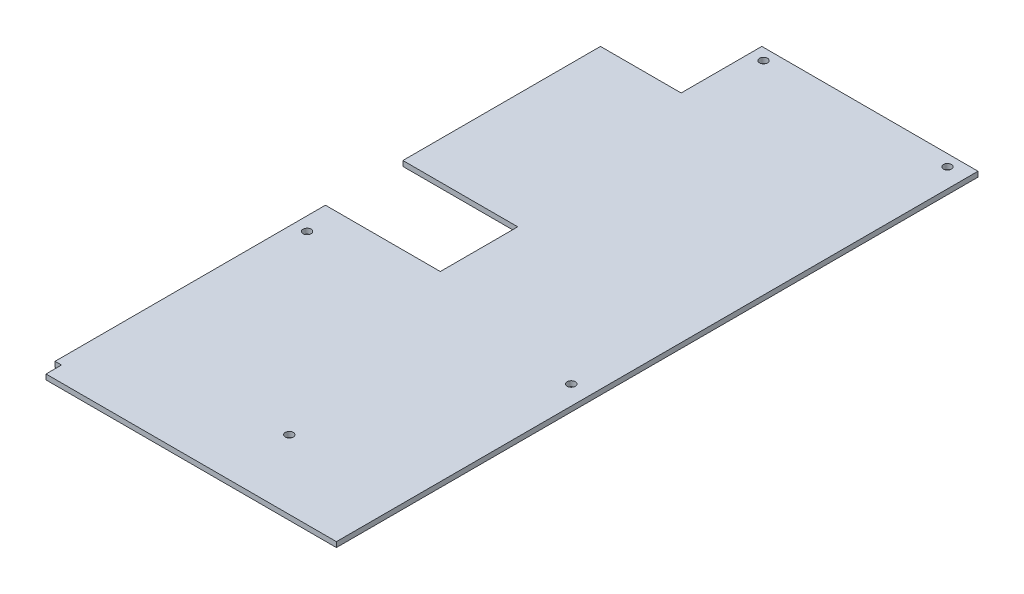
ISO-10303-21;
HEADER;
FILE_DESCRIPTION(('STEP AP214'),'2;1');
FILE_NAME('part.step','',(''),(''),'','','');
FILE_SCHEMA(('AUTOMOTIVE_DESIGN { 1 0 10303 214 1 1 1 1 }'));
ENDSEC;
DATA;
#1=APPLICATION_CONTEXT('core data for automotive mechanical design processes');
#2=APPLICATION_PROTOCOL_DEFINITION('international standard','automotive_design',2000,#1);
#3=PRODUCT_CONTEXT('',#1,'mechanical');
#4=PRODUCT('Part','Part','',(#3));
#5=PRODUCT_RELATED_PRODUCT_CATEGORY('part','',(#4));
#6=PRODUCT_DEFINITION_FORMATION('','',#4);
#7=PRODUCT_DEFINITION_CONTEXT('part definition',#1,'design');
#8=PRODUCT_DEFINITION('design','',#6,#7);
#9=PRODUCT_DEFINITION_SHAPE('','',#8);
#10=(LENGTH_UNIT() NAMED_UNIT(*) SI_UNIT(.MILLI.,.METRE.));
#11=(NAMED_UNIT(*) PLANE_ANGLE_UNIT() SI_UNIT($,.RADIAN.));
#12=(NAMED_UNIT(*) SI_UNIT($,.STERADIAN.) SOLID_ANGLE_UNIT());
#13=UNCERTAINTY_MEASURE_WITH_UNIT(LENGTH_MEASURE(1.E-05),#10,'distance_accuracy_value','');
#14=(GEOMETRIC_REPRESENTATION_CONTEXT(3) GLOBAL_UNCERTAINTY_ASSIGNED_CONTEXT((#13)) GLOBAL_UNIT_ASSIGNED_CONTEXT((#10,
#11,#12)) REPRESENTATION_CONTEXT('',''));
#15=CARTESIAN_POINT('',(0.,0.,0.));
#16=DIRECTION('',(0.,0.,1.));
#17=DIRECTION('',(1.,0.,0.));
#18=AXIS2_PLACEMENT_3D('',#15,#16,#17);
#19=CARTESIAN_POINT('',(0.,1.6,0.));
#20=DIRECTION('',(1.,0.,0.));
#21=DIRECTION('',(0.,0.,-1.));
#22=AXIS2_PLACEMENT_3D('',#19,#20,#21);
#23=PLANE('',#22);
#24=DIRECTION('',(0.,0.,1.));
#25=VECTOR('',#24,1.);
#26=CARTESIAN_POINT('',(0.,1.6,0.));
#27=LINE('',#26,#25);
#28=CARTESIAN_POINT('',(0.,1.6,-173.84));
#29=VERTEX_POINT('',#28);
#30=CARTESIAN_POINT('',(0.,1.6,-112.6));
#31=VERTEX_POINT('',#30);
#32=EDGE_CURVE('E151',#29,#31,#27,.T.);
#33=ORIENTED_EDGE('',*,*,#32,.F.);
#34=DIRECTION('',(0.,1.,0.));
#35=VECTOR('',#34,1.);
#36=CARTESIAN_POINT('',(0.,0.,-173.84));
#37=LINE('',#36,#35);
#38=CARTESIAN_POINT('',(0.,0.,-173.84));
#39=VERTEX_POINT('',#38);
#40=EDGE_CURVE('E228',#39,#29,#37,.T.);
#41=ORIENTED_EDGE('',*,*,#40,.F.);
#42=DIRECTION('',(0.,0.,1.));
#43=VECTOR('',#42,1.);
#44=CARTESIAN_POINT('',(0.,0.,0.));
#45=LINE('',#44,#43);
#46=CARTESIAN_POINT('',(0.,0.,-112.6));
#47=VERTEX_POINT('',#46);
#48=EDGE_CURVE('E157',#39,#47,#45,.T.);
#49=ORIENTED_EDGE('',*,*,#48,.T.);
#50=DIRECTION('',(0.,1.,0.));
#51=VECTOR('',#50,1.);
#52=CARTESIAN_POINT('',(0.,0.,-112.6));
#53=LINE('',#52,#51);
#54=EDGE_CURVE('E193',#47,#31,#53,.T.);
#55=ORIENTED_EDGE('',*,*,#54,.T.);
#56=EDGE_LOOP('',(#33,#41,#49,#55));
#57=FACE_BOUND('',#56,.T.);
#58=ADVANCED_FACE('F39',(#57),#23,.F.);
#59=CARTESIAN_POINT('',(0.,1.6,-88.6));
#60=VERTEX_POINT('',#59);
#61=CARTESIAN_POINT('',(0.,1.6,-4.8));
#62=VERTEX_POINT('',#61);
#63=EDGE_CURVE('E153',#60,#62,#27,.T.);
#64=ORIENTED_EDGE('',*,*,#63,.F.);
#65=DIRECTION('',(0.,1.,0.));
#66=VECTOR('',#65,1.);
#67=CARTESIAN_POINT('',(0.,0.,-88.6));
#68=LINE('',#67,#66);
#69=CARTESIAN_POINT('',(0.,0.,-88.6));
#70=VERTEX_POINT('',#69);
#71=EDGE_CURVE('E206',#70,#60,#68,.T.);
#72=ORIENTED_EDGE('',*,*,#71,.F.);
#73=CARTESIAN_POINT('',(0.,0.,-4.8));
#74=VERTEX_POINT('',#73);
#75=EDGE_CURVE('E158',#70,#74,#45,.T.);
#76=ORIENTED_EDGE('',*,*,#75,.T.);
#77=DIRECTION('',(0.,1.,0.));
#78=VECTOR('',#77,1.);
#79=CARTESIAN_POINT('',(0.,0.,-4.8));
#80=LINE('',#79,#78);
#81=EDGE_CURVE('E175',#74,#62,#80,.T.);
#82=ORIENTED_EDGE('',*,*,#81,.T.);
#83=EDGE_LOOP('',(#64,#72,#76,#82));
#84=FACE_BOUND('',#83,.T.);
#85=ADVANCED_FACE('F41',(#84),#23,.F.);
#86=CARTESIAN_POINT('',(0.,1.6,0.));
#87=DIRECTION('',(0.,0.,-1.));
#88=DIRECTION('',(-1.,0.,0.));
#89=AXIS2_PLACEMENT_3D('',#86,#87,#88);
#90=PLANE('',#89);
#91=DIRECTION('',(1.,0.,0.));
#92=VECTOR('',#91,1.);
#93=CARTESIAN_POINT('',(0.,0.,0.));
#94=LINE('',#93,#92);
#95=CARTESIAN_POINT('',(2.,0.,0.));
#96=VERTEX_POINT('',#95);
#97=CARTESIAN_POINT('',(91.9999999999999,0.,0.));
#98=VERTEX_POINT('',#97);
#99=EDGE_CURVE('E144',#96,#98,#94,.T.);
#100=ORIENTED_EDGE('',*,*,#99,.T.);
#101=DIRECTION('',(0.,1.,0.));
#102=VECTOR('',#101,1.);
#103=CARTESIAN_POINT('',(91.9999999999999,1.6,0.));
#104=LINE('',#103,#102);
#105=CARTESIAN_POINT('',(91.9999999999999,1.6,0.));
#106=VERTEX_POINT('',#105);
#107=EDGE_CURVE('E56',#98,#106,#104,.T.);
#108=ORIENTED_EDGE('',*,*,#107,.T.);
#109=DIRECTION('',(1.,0.,0.));
#110=VECTOR('',#109,1.);
#111=CARTESIAN_POINT('',(0.,1.6,0.));
#112=LINE('',#111,#110);
#113=CARTESIAN_POINT('',(2.,1.6,0.));
#114=VERTEX_POINT('',#113);
#115=EDGE_CURVE('E48',#114,#106,#112,.T.);
#116=ORIENTED_EDGE('',*,*,#115,.F.);
#117=DIRECTION('',(0.,1.,0.));
#118=VECTOR('',#117,1.);
#119=CARTESIAN_POINT('',(2.,0.,0.));
#120=LINE('',#119,#118);
#121=EDGE_CURVE('E183',#96,#114,#120,.T.);
#122=ORIENTED_EDGE('',*,*,#121,.F.);
#123=EDGE_LOOP('',(#100,#108,#116,#122));
#124=FACE_BOUND('',#123,.T.);
#125=ADVANCED_FACE('F141',(#124),#90,.F.);
#126=CARTESIAN_POINT('',(0.,1.6,-198.84));
#127=DIRECTION('',(0.,0.,1.));
#128=DIRECTION('',(1.,0.,0.));
#129=AXIS2_PLACEMENT_3D('',#126,#127,#128);
#130=PLANE('',#129);
#131=DIRECTION('',(-1.,0.,0.));
#132=VECTOR('',#131,1.);
#133=CARTESIAN_POINT('',(0.,1.6,-198.84));
#134=LINE('',#133,#132);
#135=CARTESIAN_POINT('',(91.9999999999999,1.6,-198.84));
#136=VERTEX_POINT('',#135);
#137=CARTESIAN_POINT('',(24.9999999999999,1.6,-198.84));
#138=VERTEX_POINT('',#137);
#139=EDGE_CURVE('E11',#136,#138,#134,.T.);
#140=ORIENTED_EDGE('',*,*,#139,.F.);
#141=DIRECTION('',(0.,1.,0.));
#142=VECTOR('',#141,1.);
#143=CARTESIAN_POINT('',(91.9999999999999,1.6,-198.84));
#144=LINE('',#143,#142);
#145=CARTESIAN_POINT('',(91.9999999999999,0.,-198.84));
#146=VERTEX_POINT('',#145);
#147=EDGE_CURVE('E131',#146,#136,#144,.T.);
#148=ORIENTED_EDGE('',*,*,#147,.F.);
#149=DIRECTION('',(-1.,0.,0.));
#150=VECTOR('',#149,1.);
#151=CARTESIAN_POINT('',(0.,0.,-198.84));
#152=LINE('',#151,#150);
#153=CARTESIAN_POINT('',(24.9999999999999,0.,-198.84));
#154=VERTEX_POINT('',#153);
#155=EDGE_CURVE('E43',#146,#154,#152,.T.);
#156=ORIENTED_EDGE('',*,*,#155,.T.);
#157=DIRECTION('',(0.,1.,0.));
#158=VECTOR('',#157,1.);
#159=CARTESIAN_POINT('',(24.9999999999999,0.,-198.84));
#160=LINE('',#159,#158);
#161=EDGE_CURVE('E220',#154,#138,#160,.T.);
#162=ORIENTED_EDGE('',*,*,#161,.T.);
#163=EDGE_LOOP('',(#140,#148,#156,#162));
#164=FACE_BOUND('',#163,.T.);
#165=ADVANCED_FACE('F273',(#164),#130,.F.);
#166=CARTESIAN_POINT('',(0.,1.6,-198.84));
#167=DIRECTION('',(0.,-1.,0.));
#168=DIRECTION('',(0.,0.,-1.));
#169=AXIS2_PLACEMENT_3D('',#166,#167,#168);
#170=PLANE('',#169);
#171=CARTESIAN_POINT('',(55.9999999999999,1.6,-21.4));
#172=DIRECTION('',(0.,1.,0.));
#173=DIRECTION('',(0.,0.,1.));
#174=AXIS2_PLACEMENT_3D('',#171,#172,#173);
#175=CIRCLE('',#174,1.25);
#176=CARTESIAN_POINT('',(55.9999999999999,1.6,-20.15));
#177=VERTEX_POINT('',#176);
#178=EDGE_CURVE('E135',#177,#177,#175,.T.);
#179=ORIENTED_EDGE('',*,*,#178,.F.);
#180=EDGE_LOOP('',(#179));
#181=FACE_BOUND('',#180,.T.);
#182=CARTESIAN_POINT('',(4.19999999999986,1.6,-78.7));
#183=DIRECTION('',(0.,1.,0.));
#184=DIRECTION('',(0.,0.,1.));
#185=AXIS2_PLACEMENT_3D('',#182,#183,#184);
#186=CIRCLE('',#185,1.25);
#187=CARTESIAN_POINT('',(4.19999999999986,1.6,-77.45));
#188=VERTEX_POINT('',#187);
#189=EDGE_CURVE('E262',#188,#188,#186,.T.);
#190=ORIENTED_EDGE('',*,*,#189,.F.);
#191=EDGE_LOOP('',(#190));
#192=FACE_BOUND('',#191,.T.);
#193=CARTESIAN_POINT('',(86.0769999999998,1.6,-78.7));
#194=DIRECTION('',(0.,1.,0.));
#195=DIRECTION('',(0.,0.,1.));
#196=AXIS2_PLACEMENT_3D('',#193,#194,#195);
#197=CIRCLE('',#196,1.25);
#198=CARTESIAN_POINT('',(86.0769999999998,1.6,-77.45));
#199=VERTEX_POINT('',#198);
#200=EDGE_CURVE('E256',#199,#199,#197,.T.);
#201=ORIENTED_EDGE('',*,*,#200,.F.);
#202=EDGE_LOOP('',(#201));
#203=FACE_BOUND('',#202,.T.);
#204=CARTESIAN_POINT('',(86.0769999999998,1.6,-195.3));
#205=DIRECTION('',(0.,1.,0.));
#206=DIRECTION('',(0.,0.,1.));
#207=AXIS2_PLACEMENT_3D('',#204,#205,#206);
#208=CIRCLE('',#207,1.25);
#209=CARTESIAN_POINT('',(86.0769999999998,1.6,-194.05));
#210=VERTEX_POINT('',#209);
#211=EDGE_CURVE('E250',#210,#210,#208,.T.);
#212=ORIENTED_EDGE('',*,*,#211,.F.);
#213=EDGE_LOOP('',(#212));
#214=FACE_BOUND('',#213,.T.);
#215=CARTESIAN_POINT('',(29.0769999999998,1.6,-195.3));
#216=DIRECTION('',(0.,1.,0.));
#217=DIRECTION('',(0.,0.,1.));
#218=AXIS2_PLACEMENT_3D('',#215,#216,#217);
#219=CIRCLE('',#218,1.25);
#220=CARTESIAN_POINT('',(29.0769999999998,1.6,-194.05));
#221=VERTEX_POINT('',#220);
#222=EDGE_CURVE('E244',#221,#221,#219,.T.);
#223=ORIENTED_EDGE('',*,*,#222,.F.);
#224=EDGE_LOOP('',(#223));
#225=FACE_BOUND('',#224,.T.);
#226=ORIENTED_EDGE('',*,*,#115,.T.);
#227=DIRECTION('',(0.,0.,-1.));
#228=VECTOR('',#227,1.);
#229=CARTESIAN_POINT('',(91.9999999999999,1.6,0.));
#230=LINE('',#229,#228);
#231=EDGE_CURVE('E128',#106,#136,#230,.T.);
#232=ORIENTED_EDGE('',*,*,#231,.T.);
#233=ORIENTED_EDGE('',*,*,#139,.T.);
#234=DIRECTION('',(0.,0.,-1.));
#235=VECTOR('',#234,1.);
#236=CARTESIAN_POINT('',(24.9999999999999,1.6,-198.84));
#237=LINE('',#236,#235);
#238=CARTESIAN_POINT('',(24.9999999999999,1.6,-173.84));
#239=VERTEX_POINT('',#238);
#240=EDGE_CURVE('E233',#239,#138,#237,.T.);
#241=ORIENTED_EDGE('',*,*,#240,.F.);
#242=DIRECTION('',(1.,0.,0.));
#243=VECTOR('',#242,1.);
#244=CARTESIAN_POINT('',(0.,1.6,-173.84));
#245=LINE('',#244,#243);
#246=EDGE_CURVE('E237',#29,#239,#245,.T.);
#247=ORIENTED_EDGE('',*,*,#246,.F.);
#248=ORIENTED_EDGE('',*,*,#32,.T.);
#249=DIRECTION('',(-1.,0.,0.));
#250=VECTOR('',#249,1.);
#251=CARTESIAN_POINT('',(0.,1.6,-112.6));
#252=LINE('',#251,#250);
#253=CARTESIAN_POINT('',(35.6,1.6,-112.6));
#254=VERTEX_POINT('',#253);
#255=EDGE_CURVE('E203',#254,#31,#252,.T.);
#256=ORIENTED_EDGE('',*,*,#255,.F.);
#257=DIRECTION('',(0.,0.,-1.));
#258=VECTOR('',#257,1.);
#259=CARTESIAN_POINT('',(35.6,1.6,-112.6));
#260=LINE('',#259,#258);
#261=CARTESIAN_POINT('',(35.6,1.6,-88.6));
#262=VERTEX_POINT('',#261);
#263=EDGE_CURVE('E219',#262,#254,#260,.T.);
#264=ORIENTED_EDGE('',*,*,#263,.F.);
#265=DIRECTION('',(1.,0.,0.));
#266=VECTOR('',#265,1.);
#267=CARTESIAN_POINT('',(0.,1.6,-88.6));
#268=LINE('',#267,#266);
#269=EDGE_CURVE('E168',#60,#262,#268,.T.);
#270=ORIENTED_EDGE('',*,*,#269,.F.);
#271=ORIENTED_EDGE('',*,*,#63,.T.);
#272=DIRECTION('',(-1.,0.,0.));
#273=VECTOR('',#272,1.);
#274=CARTESIAN_POINT('',(0.,1.6,-4.8));
#275=LINE('',#274,#273);
#276=CARTESIAN_POINT('',(2.,1.6,-4.8));
#277=VERTEX_POINT('',#276);
#278=EDGE_CURVE('E165',#277,#62,#275,.T.);
#279=ORIENTED_EDGE('',*,*,#278,.F.);
#280=DIRECTION('',(0.,0.,-1.));
#281=VECTOR('',#280,1.);
#282=CARTESIAN_POINT('',(2.,1.6,0.));
#283=LINE('',#282,#281);
#284=EDGE_CURVE('E150',#114,#277,#283,.T.);
#285=ORIENTED_EDGE('',*,*,#284,.F.);
#286=EDGE_LOOP('',(#226,#232,#233,#241,#247,#248,#256,#264,#270,#271,#279,#285));
#287=FACE_BOUND('',#286,.T.);
#288=ADVANCED_FACE('F147',(#181,#192,#203,#214,#225,#287),#170,.F.);
#289=CARTESIAN_POINT('',(0.,0.,-198.84));
#290=DIRECTION('',(0.,-1.,0.));
#291=DIRECTION('',(0.,0.,-1.));
#292=AXIS2_PLACEMENT_3D('',#289,#290,#291);
#293=PLANE('',#292);
#294=DIRECTION('',(0.,0.,-1.));
#295=VECTOR('',#294,1.);
#296=CARTESIAN_POINT('',(91.9999999999999,0.,0.));
#297=LINE('',#296,#295);
#298=EDGE_CURVE('E136',#98,#146,#297,.T.);
#299=ORIENTED_EDGE('',*,*,#298,.F.);
#300=ORIENTED_EDGE('',*,*,#99,.F.);
#301=DIRECTION('',(0.,0.,-1.));
#302=VECTOR('',#301,1.);
#303=CARTESIAN_POINT('',(2.,0.,0.));
#304=LINE('',#303,#302);
#305=CARTESIAN_POINT('',(2.,0.,-4.8));
#306=VERTEX_POINT('',#305);
#307=EDGE_CURVE('E179',#96,#306,#304,.T.);
#308=ORIENTED_EDGE('',*,*,#307,.T.);
#309=DIRECTION('',(-1.,0.,0.));
#310=VECTOR('',#309,1.);
#311=CARTESIAN_POINT('',(0.,0.,-4.8));
#312=LINE('',#311,#310);
#313=EDGE_CURVE('E186',#306,#74,#312,.T.);
#314=ORIENTED_EDGE('',*,*,#313,.T.);
#315=ORIENTED_EDGE('',*,*,#75,.F.);
#316=DIRECTION('',(1.,0.,0.));
#317=VECTOR('',#316,1.);
#318=CARTESIAN_POINT('',(0.,0.,-88.6));
#319=LINE('',#318,#317);
#320=CARTESIAN_POINT('',(35.6,0.,-88.6));
#321=VERTEX_POINT('',#320);
#322=EDGE_CURVE('E215',#70,#321,#319,.T.);
#323=ORIENTED_EDGE('',*,*,#322,.T.);
#324=DIRECTION('',(0.,0.,-1.));
#325=VECTOR('',#324,1.);
#326=CARTESIAN_POINT('',(35.6,0.,-112.6));
#327=LINE('',#326,#325);
#328=CARTESIAN_POINT('',(35.6,0.,-112.6));
#329=VERTEX_POINT('',#328);
#330=EDGE_CURVE('E210',#321,#329,#327,.T.);
#331=ORIENTED_EDGE('',*,*,#330,.T.);
#332=DIRECTION('',(-1.,0.,0.));
#333=VECTOR('',#332,1.);
#334=CARTESIAN_POINT('',(0.,0.,-112.6));
#335=LINE('',#334,#333);
#336=EDGE_CURVE('E207',#329,#47,#335,.T.);
#337=ORIENTED_EDGE('',*,*,#336,.T.);
#338=ORIENTED_EDGE('',*,*,#48,.F.);
#339=DIRECTION('',(1.,0.,0.));
#340=VECTOR('',#339,1.);
#341=CARTESIAN_POINT('',(0.,0.,-173.84));
#342=LINE('',#341,#340);
#343=CARTESIAN_POINT('',(24.9999999999999,0.,-173.84));
#344=VERTEX_POINT('',#343);
#345=EDGE_CURVE('E236',#39,#344,#342,.T.);
#346=ORIENTED_EDGE('',*,*,#345,.T.);
#347=DIRECTION('',(0.,0.,-1.));
#348=VECTOR('',#347,1.);
#349=CARTESIAN_POINT('',(24.9999999999999,0.,-198.84));
#350=LINE('',#349,#348);
#351=EDGE_CURVE('E64',#344,#154,#350,.T.);
#352=ORIENTED_EDGE('',*,*,#351,.T.);
#353=ORIENTED_EDGE('',*,*,#155,.F.);
#354=EDGE_LOOP('',(#299,#300,#308,#314,#315,#323,#331,#337,#338,#346,#352,#353));
#355=FACE_BOUND('',#354,.T.);
#356=CARTESIAN_POINT('',(55.9999999999999,0.,-21.4));
#357=DIRECTION('',(0.,1.,0.));
#358=DIRECTION('',(0.,0.,1.));
#359=AXIS2_PLACEMENT_3D('',#356,#357,#358);
#360=CIRCLE('',#359,1.25);
#361=CARTESIAN_POINT('',(55.9999999999999,0.,-20.15));
#362=VERTEX_POINT('',#361);
#363=EDGE_CURVE('E265',#362,#362,#360,.T.);
#364=ORIENTED_EDGE('',*,*,#363,.T.);
#365=EDGE_LOOP('',(#364));
#366=FACE_BOUND('',#365,.T.);
#367=CARTESIAN_POINT('',(4.19999999999986,0.,-78.7));
#368=DIRECTION('',(0.,1.,0.));
#369=DIRECTION('',(0.,0.,1.));
#370=AXIS2_PLACEMENT_3D('',#367,#368,#369);
#371=CIRCLE('',#370,1.25);
#372=CARTESIAN_POINT('',(4.19999999999986,0.,-77.45));
#373=VERTEX_POINT('',#372);
#374=EDGE_CURVE('E259',#373,#373,#371,.T.);
#375=ORIENTED_EDGE('',*,*,#374,.T.);
#376=EDGE_LOOP('',(#375));
#377=FACE_BOUND('',#376,.T.);
#378=CARTESIAN_POINT('',(86.0769999999998,0.,-78.7));
#379=DIRECTION('',(0.,1.,0.));
#380=DIRECTION('',(0.,0.,1.));
#381=AXIS2_PLACEMENT_3D('',#378,#379,#380);
#382=CIRCLE('',#381,1.25);
#383=CARTESIAN_POINT('',(86.0769999999998,0.,-77.45));
#384=VERTEX_POINT('',#383);
#385=EDGE_CURVE('E253',#384,#384,#382,.T.);
#386=ORIENTED_EDGE('',*,*,#385,.T.);
#387=EDGE_LOOP('',(#386));
#388=FACE_BOUND('',#387,.T.);
#389=CARTESIAN_POINT('',(86.0769999999998,0.,-195.3));
#390=DIRECTION('',(0.,1.,0.));
#391=DIRECTION('',(0.,0.,1.));
#392=AXIS2_PLACEMENT_3D('',#389,#390,#391);
#393=CIRCLE('',#392,1.25);
#394=CARTESIAN_POINT('',(86.0769999999998,0.,-194.05));
#395=VERTEX_POINT('',#394);
#396=EDGE_CURVE('E247',#395,#395,#393,.T.);
#397=ORIENTED_EDGE('',*,*,#396,.T.);
#398=EDGE_LOOP('',(#397));
#399=FACE_BOUND('',#398,.T.);
#400=CARTESIAN_POINT('',(29.0769999999998,0.,-195.3));
#401=DIRECTION('',(0.,1.,0.));
#402=DIRECTION('',(0.,0.,1.));
#403=AXIS2_PLACEMENT_3D('',#400,#401,#402);
#404=CIRCLE('',#403,1.25);
#405=CARTESIAN_POINT('',(29.0769999999998,0.,-194.05));
#406=VERTEX_POINT('',#405);
#407=EDGE_CURVE('E240',#406,#406,#404,.T.);
#408=ORIENTED_EDGE('',*,*,#407,.T.);
#409=EDGE_LOOP('',(#408));
#410=FACE_BOUND('',#409,.T.);
#411=ADVANCED_FACE('F274',(#355,#366,#377,#388,#399,#410),#293,.T.);
#412=CARTESIAN_POINT('',(0.,0.,-4.8));
#413=DIRECTION('',(0.,0.,-1.));
#414=DIRECTION('',(-1.,0.,0.));
#415=AXIS2_PLACEMENT_3D('',#412,#413,#414);
#416=PLANE('',#415);
#417=ORIENTED_EDGE('',*,*,#278,.T.);
#418=ORIENTED_EDGE('',*,*,#81,.F.);
#419=ORIENTED_EDGE('',*,*,#313,.F.);
#420=DIRECTION('',(0.,1.,0.));
#421=VECTOR('',#420,1.);
#422=CARTESIAN_POINT('',(2.,0.,-4.8));
#423=LINE('',#422,#421);
#424=EDGE_CURVE('E178',#306,#277,#423,.T.);
#425=ORIENTED_EDGE('',*,*,#424,.T.);
#426=EDGE_LOOP('',(#417,#418,#419,#425));
#427=FACE_BOUND('',#426,.T.);
#428=ADVANCED_FACE('F174',(#427),#416,.F.);
#429=CARTESIAN_POINT('',(2.,0.,0.));
#430=DIRECTION('',(1.,0.,0.));
#431=DIRECTION('',(0.,0.,-1.));
#432=AXIS2_PLACEMENT_3D('',#429,#430,#431);
#433=PLANE('',#432);
#434=ORIENTED_EDGE('',*,*,#284,.T.);
#435=ORIENTED_EDGE('',*,*,#424,.F.);
#436=ORIENTED_EDGE('',*,*,#307,.F.);
#437=ORIENTED_EDGE('',*,*,#121,.T.);
#438=EDGE_LOOP('',(#434,#435,#436,#437));
#439=FACE_BOUND('',#438,.T.);
#440=ADVANCED_FACE('F311',(#439),#433,.F.);
#441=CARTESIAN_POINT('',(0.,0.,-112.6));
#442=DIRECTION('',(0.,0.,-1.));
#443=DIRECTION('',(-1.,0.,0.));
#444=AXIS2_PLACEMENT_3D('',#441,#442,#443);
#445=PLANE('',#444);
#446=ORIENTED_EDGE('',*,*,#255,.T.);
#447=ORIENTED_EDGE('',*,*,#54,.F.);
#448=ORIENTED_EDGE('',*,*,#336,.F.);
#449=DIRECTION('',(0.,1.,0.));
#450=VECTOR('',#449,1.);
#451=CARTESIAN_POINT('',(35.6,0.,-112.6));
#452=LINE('',#451,#450);
#453=EDGE_CURVE('E195',#329,#254,#452,.T.);
#454=ORIENTED_EDGE('',*,*,#453,.T.);
#455=EDGE_LOOP('',(#446,#447,#448,#454));
#456=FACE_BOUND('',#455,.T.);
#457=ADVANCED_FACE('F314',(#456),#445,.F.);
#458=CARTESIAN_POINT('',(35.6,0.,-112.6));
#459=DIRECTION('',(1.,0.,0.));
#460=DIRECTION('',(0.,0.,-1.));
#461=AXIS2_PLACEMENT_3D('',#458,#459,#460);
#462=PLANE('',#461);
#463=ORIENTED_EDGE('',*,*,#263,.T.);
#464=ORIENTED_EDGE('',*,*,#453,.F.);
#465=ORIENTED_EDGE('',*,*,#330,.F.);
#466=DIRECTION('',(0.,1.,0.));
#467=VECTOR('',#466,1.);
#468=CARTESIAN_POINT('',(35.6,0.,-88.6));
#469=LINE('',#468,#467);
#470=EDGE_CURVE('E200',#321,#262,#469,.T.);
#471=ORIENTED_EDGE('',*,*,#470,.T.);
#472=EDGE_LOOP('',(#463,#464,#465,#471));
#473=FACE_BOUND('',#472,.T.);
#474=ADVANCED_FACE('F291',(#473),#462,.F.);
#475=CARTESIAN_POINT('',(0.,0.,-88.6));
#476=DIRECTION('',(0.,0.,1.));
#477=DIRECTION('',(1.,0.,0.));
#478=AXIS2_PLACEMENT_3D('',#475,#476,#477);
#479=PLANE('',#478);
#480=ORIENTED_EDGE('',*,*,#269,.T.);
#481=ORIENTED_EDGE('',*,*,#470,.F.);
#482=ORIENTED_EDGE('',*,*,#322,.F.);
#483=ORIENTED_EDGE('',*,*,#71,.T.);
#484=EDGE_LOOP('',(#480,#481,#482,#483));
#485=FACE_BOUND('',#484,.T.);
#486=ADVANCED_FACE('F283',(#485),#479,.F.);
#487=CARTESIAN_POINT('',(24.9999999999999,0.,-198.84));
#488=DIRECTION('',(1.,0.,0.));
#489=DIRECTION('',(0.,0.,-1.));
#490=AXIS2_PLACEMENT_3D('',#487,#488,#489);
#491=PLANE('',#490);
#492=ORIENTED_EDGE('',*,*,#240,.T.);
#493=ORIENTED_EDGE('',*,*,#161,.F.);
#494=ORIENTED_EDGE('',*,*,#351,.F.);
#495=DIRECTION('',(0.,1.,0.));
#496=VECTOR('',#495,1.);
#497=CARTESIAN_POINT('',(24.9999999999999,0.,-173.84));
#498=LINE('',#497,#496);
#499=EDGE_CURVE('E230',#344,#239,#498,.T.);
#500=ORIENTED_EDGE('',*,*,#499,.T.);
#501=EDGE_LOOP('',(#492,#493,#494,#500));
#502=FACE_BOUND('',#501,.T.);
#503=ADVANCED_FACE('F281',(#502),#491,.F.);
#504=CARTESIAN_POINT('',(0.,0.,-173.84));
#505=DIRECTION('',(0.,0.,1.));
#506=DIRECTION('',(1.,0.,0.));
#507=AXIS2_PLACEMENT_3D('',#504,#505,#506);
#508=PLANE('',#507);
#509=ORIENTED_EDGE('',*,*,#246,.T.);
#510=ORIENTED_EDGE('',*,*,#499,.F.);
#511=ORIENTED_EDGE('',*,*,#345,.F.);
#512=ORIENTED_EDGE('',*,*,#40,.T.);
#513=EDGE_LOOP('',(#509,#510,#511,#512));
#514=FACE_BOUND('',#513,.T.);
#515=ADVANCED_FACE('F278',(#514),#508,.F.);
#516=CARTESIAN_POINT('',(29.0769999999998,0.,-195.3));
#517=DIRECTION('',(0.,1.,0.));
#518=DIRECTION('',(0.,0.,1.));
#519=AXIS2_PLACEMENT_3D('',#516,#517,#518);
#520=CYLINDRICAL_SURFACE('',#519,1.25);
#521=ORIENTED_EDGE('',*,*,#407,.F.);
#522=EDGE_LOOP('',(#521));
#523=FACE_BOUND('',#522,.T.);
#524=ORIENTED_EDGE('',*,*,#222,.T.);
#525=EDGE_LOOP('',(#524));
#526=FACE_BOUND('',#525,.T.);
#527=ADVANCED_FACE('F289',(#523,#526),#520,.F.);
#528=CARTESIAN_POINT('',(86.0769999999998,0.,-195.3));
#529=DIRECTION('',(0.,1.,0.));
#530=DIRECTION('',(0.,0.,1.));
#531=AXIS2_PLACEMENT_3D('',#528,#529,#530);
#532=CYLINDRICAL_SURFACE('',#531,1.25);
#533=ORIENTED_EDGE('',*,*,#396,.F.);
#534=EDGE_LOOP('',(#533));
#535=FACE_BOUND('',#534,.T.);
#536=ORIENTED_EDGE('',*,*,#211,.T.);
#537=EDGE_LOOP('',(#536));
#538=FACE_BOUND('',#537,.T.);
#539=ADVANCED_FACE('F360',(#535,#538),#532,.F.);
#540=CARTESIAN_POINT('',(86.0769999999998,0.,-78.7));
#541=DIRECTION('',(0.,1.,0.));
#542=DIRECTION('',(0.,0.,1.));
#543=AXIS2_PLACEMENT_3D('',#540,#541,#542);
#544=CYLINDRICAL_SURFACE('',#543,1.25);
#545=ORIENTED_EDGE('',*,*,#385,.F.);
#546=EDGE_LOOP('',(#545));
#547=FACE_BOUND('',#546,.T.);
#548=ORIENTED_EDGE('',*,*,#200,.T.);
#549=EDGE_LOOP('',(#548));
#550=FACE_BOUND('',#549,.T.);
#551=ADVANCED_FACE('F370',(#547,#550),#544,.F.);
#552=CARTESIAN_POINT('',(4.19999999999986,0.,-78.7));
#553=DIRECTION('',(0.,1.,0.));
#554=DIRECTION('',(0.,0.,1.));
#555=AXIS2_PLACEMENT_3D('',#552,#553,#554);
#556=CYLINDRICAL_SURFACE('',#555,1.25);
#557=ORIENTED_EDGE('',*,*,#374,.F.);
#558=EDGE_LOOP('',(#557));
#559=FACE_BOUND('',#558,.T.);
#560=ORIENTED_EDGE('',*,*,#189,.T.);
#561=EDGE_LOOP('',(#560));
#562=FACE_BOUND('',#561,.T.);
#563=ADVANCED_FACE('F381',(#559,#562),#556,.F.);
#564=CARTESIAN_POINT('',(55.9999999999999,0.,-21.4));
#565=DIRECTION('',(0.,1.,0.));
#566=DIRECTION('',(0.,0.,1.));
#567=AXIS2_PLACEMENT_3D('',#564,#565,#566);
#568=CYLINDRICAL_SURFACE('',#567,1.25);
#569=ORIENTED_EDGE('',*,*,#363,.F.);
#570=EDGE_LOOP('',(#569));
#571=FACE_BOUND('',#570,.T.);
#572=ORIENTED_EDGE('',*,*,#178,.T.);
#573=EDGE_LOOP('',(#572));
#574=FACE_BOUND('',#573,.T.);
#575=ADVANCED_FACE('F392',(#571,#574),#568,.F.);
#576=CARTESIAN_POINT('',(91.9999999999999,1.6,0.));
#577=DIRECTION('',(-1.,0.,0.));
#578=DIRECTION('',(0.,0.,1.));
#579=AXIS2_PLACEMENT_3D('',#576,#577,#578);
#580=PLANE('',#579);
#581=ORIENTED_EDGE('',*,*,#147,.T.);
#582=ORIENTED_EDGE('',*,*,#231,.F.);
#583=ORIENTED_EDGE('',*,*,#107,.F.);
#584=ORIENTED_EDGE('',*,*,#298,.T.);
#585=EDGE_LOOP('',(#581,#582,#583,#584));
#586=FACE_BOUND('',#585,.T.);
#587=ADVANCED_FACE('F129',(#586),#580,.F.);
#588=CLOSED_SHELL('',(#58,#85,#125,#165,#288,#411,#428,#440,#457,#474,#486,#503,#515,#527,#539,
#551,#563,#575,#587));
#589=MANIFOLD_SOLID_BREP('B2',#588);
#590=ADVANCED_BREP_SHAPE_REPRESENTATION('',(#18,#589),#14);
#591=SHAPE_DEFINITION_REPRESENTATION(#9,#590);
ENDSEC;
END-ISO-10303-21;
